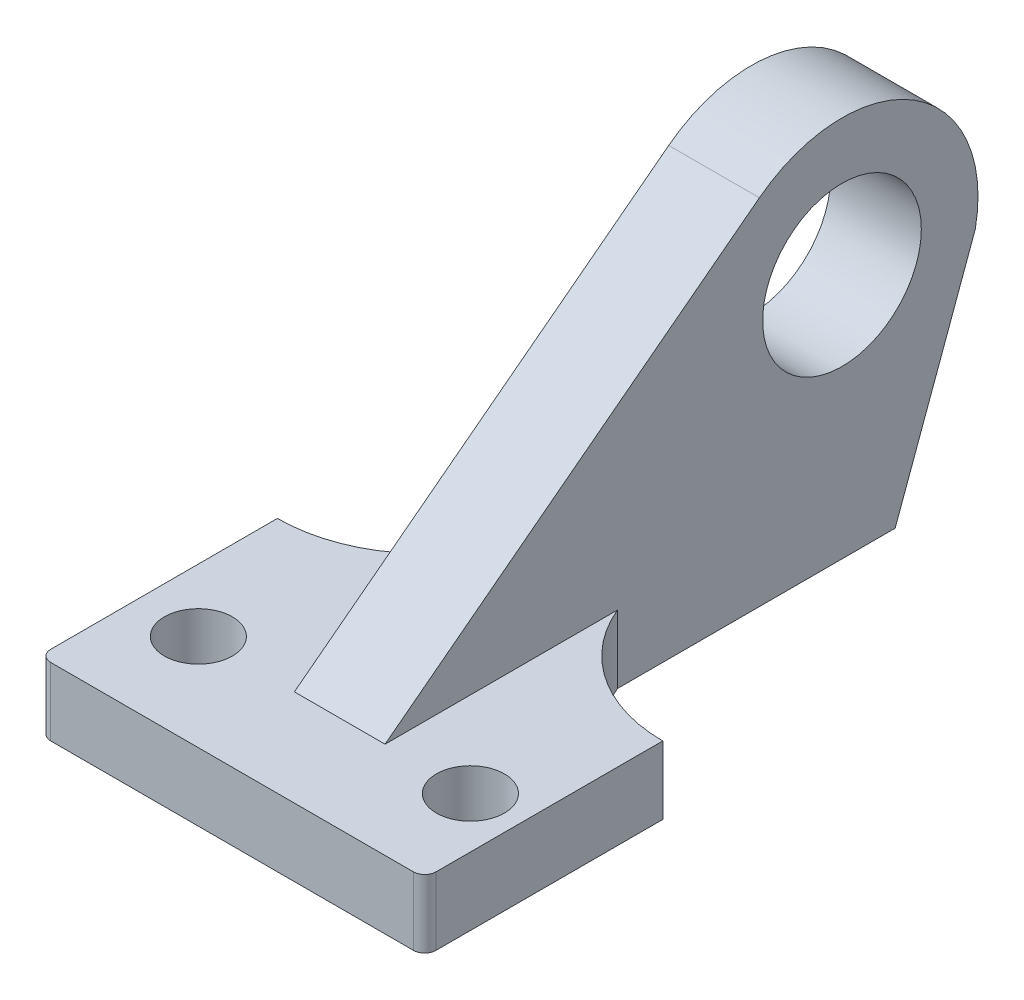
ISO-10303-21;
HEADER;
FILE_DESCRIPTION(('STEP AP214'),'2;1');
FILE_NAME('part.step','',(''),(''),'','','');
FILE_SCHEMA(('AUTOMOTIVE_DESIGN { 1 0 10303 214 1 1 1 1 }'));
ENDSEC;
DATA;
#1=APPLICATION_CONTEXT('core data for automotive mechanical design processes');
#2=APPLICATION_PROTOCOL_DEFINITION('international standard','automotive_design',2000,#1);
#3=PRODUCT_CONTEXT('',#1,'mechanical');
#4=PRODUCT('Part','Part','',(#3));
#5=PRODUCT_RELATED_PRODUCT_CATEGORY('part','',(#4));
#6=PRODUCT_DEFINITION_FORMATION('','',#4);
#7=PRODUCT_DEFINITION_CONTEXT('part definition',#1,'design');
#8=PRODUCT_DEFINITION('design','',#6,#7);
#9=PRODUCT_DEFINITION_SHAPE('','',#8);
#10=(LENGTH_UNIT() NAMED_UNIT(*) SI_UNIT(.MILLI.,.METRE.));
#11=(NAMED_UNIT(*) PLANE_ANGLE_UNIT() SI_UNIT($,.RADIAN.));
#12=(NAMED_UNIT(*) SI_UNIT($,.STERADIAN.) SOLID_ANGLE_UNIT());
#13=UNCERTAINTY_MEASURE_WITH_UNIT(LENGTH_MEASURE(1.E-05),#10,'distance_accuracy_value','');
#14=(GEOMETRIC_REPRESENTATION_CONTEXT(3) GLOBAL_UNCERTAINTY_ASSIGNED_CONTEXT((#13)) GLOBAL_UNIT_ASSIGNED_CONTEXT((#10,
#11,#12)) REPRESENTATION_CONTEXT('',''));
#15=CARTESIAN_POINT('',(0.,0.,0.));
#16=DIRECTION('',(0.,0.,1.));
#17=DIRECTION('',(1.,0.,0.));
#18=AXIS2_PLACEMENT_3D('',#15,#16,#17);
#19=CARTESIAN_POINT('',(38.4671532846715,-12.,-68.));
#20=DIRECTION('',(0.,1.,0.));
#21=DIRECTION('',(0.,0.,1.));
#22=AXIS2_PLACEMENT_3D('',#19,#20,#21);
#23=CYLINDRICAL_SURFACE('',#22,26.);
#24=CARTESIAN_POINT('',(38.4671532846715,-12.,-68.));
#25=DIRECTION('',(0.,1.,0.));
#26=DIRECTION('',(0.,0.,1.));
#27=AXIS2_PLACEMENT_3D('',#24,#25,#26);
#28=CIRCLE('',#27,26.);
#29=CARTESIAN_POINT('',(38.4671532846715,-12.,-42.));
#30=VERTEX_POINT('',#29);
#31=CARTESIAN_POINT('',(14.4671532846715,-12.,-58.));
#32=VERTEX_POINT('',#31);
#33=EDGE_CURVE('E228',#30,#32,#28,.F.);
#34=ORIENTED_EDGE('',*,*,#33,.T.);
#35=DIRECTION('',(0.,1.,0.));
#36=VECTOR('',#35,1.);
#37=CARTESIAN_POINT('',(14.4671532846715,-12.,-58.));
#38=LINE('',#37,#36);
#39=CARTESIAN_POINT('',(14.4671532846715,0.,-58.));
#40=VERTEX_POINT('',#39);
#41=EDGE_CURVE('E156',#32,#40,#38,.T.);
#42=ORIENTED_EDGE('',*,*,#41,.T.);
#43=CARTESIAN_POINT('',(38.4671532846715,0.,-68.));
#44=DIRECTION('',(0.,1.,0.));
#45=DIRECTION('',(0.,0.,1.));
#46=AXIS2_PLACEMENT_3D('',#43,#44,#45);
#47=CIRCLE('',#46,26.);
#48=CARTESIAN_POINT('',(38.4671532846715,0.,-42.));
#49=VERTEX_POINT('',#48);
#50=EDGE_CURVE('E159',#49,#40,#47,.F.);
#51=ORIENTED_EDGE('',*,*,#50,.F.);
#52=DIRECTION('',(0.,1.,0.));
#53=VECTOR('',#52,1.);
#54=CARTESIAN_POINT('',(38.4671532846715,-12.,-42.));
#55=LINE('',#54,#53);
#56=EDGE_CURVE('E185',#30,#49,#55,.T.);
#57=ORIENTED_EDGE('',*,*,#56,.F.);
#58=EDGE_LOOP('',(#34,#42,#51,#57));
#59=FACE_BOUND('',#58,.T.);
#60=ADVANCED_FACE('F39',(#59),#23,.F.);
#61=CARTESIAN_POINT('',(0.,0.,0.));
#62=DIRECTION('',(0.,1.,0.));
#63=DIRECTION('',(0.,0.,1.));
#64=AXIS2_PLACEMENT_3D('',#61,#62,#63);
#65=PLANE('',#64);
#66=CARTESIAN_POINT('',(-18.4742702859235,0.,-17.));
#67=DIRECTION('',(0.,1.,0.));
#68=DIRECTION('',(0.,0.,1.));
#69=AXIS2_PLACEMENT_3D('',#66,#67,#68);
#70=CIRCLE('',#69,6.);
#71=CARTESIAN_POINT('',(-18.4742702859235,0.,-11.));
#72=VERTEX_POINT('',#71);
#73=EDGE_CURVE('E173',#72,#72,#70,.T.);
#74=ORIENTED_EDGE('',*,*,#73,.F.);
#75=EDGE_LOOP('',(#74));
#76=FACE_BOUND('',#75,.T.);
#77=CARTESIAN_POINT('',(29.5257297140765,0.,-17.));
#78=DIRECTION('',(0.,1.,0.));
#79=DIRECTION('',(0.,0.,1.));
#80=AXIS2_PLACEMENT_3D('',#77,#78,#79);
#81=CIRCLE('',#80,6.);
#82=CARTESIAN_POINT('',(29.5257297140765,0.,-11.));
#83=VERTEX_POINT('',#82);
#84=EDGE_CURVE('E176',#83,#83,#81,.T.);
#85=ORIENTED_EDGE('',*,*,#84,.F.);
#86=EDGE_LOOP('',(#85));
#87=FACE_BOUND('',#86,.T.);
#88=ORIENTED_EDGE('',*,*,#50,.T.);
#89=DIRECTION('',(0.,0.,1.));
#90=VECTOR('',#89,1.);
#91=CARTESIAN_POINT('',(14.4671532846715,0.,0.));
#92=LINE('',#91,#90);
#93=CARTESIAN_POINT('',(14.4671532846715,0.,-17.));
#94=VERTEX_POINT('',#93);
#95=EDGE_CURVE('E11',#40,#94,#92,.T.);
#96=ORIENTED_EDGE('',*,*,#95,.T.);
#97=DIRECTION('',(-1.,0.,0.));
#98=VECTOR('',#97,1.);
#99=CARTESIAN_POINT('',(14.4671532846715,0.,-17.));
#100=LINE('',#99,#98);
#101=CARTESIAN_POINT('',(-1.53284671532846,0.,-17.));
#102=VERTEX_POINT('',#101);
#103=EDGE_CURVE('E201',#94,#102,#100,.T.);
#104=ORIENTED_EDGE('',*,*,#103,.T.);
#105=DIRECTION('',(0.,0.,1.));
#106=VECTOR('',#105,1.);
#107=CARTESIAN_POINT('',(-1.53284671532846,0.,0.));
#108=LINE('',#107,#106);
#109=CARTESIAN_POINT('',(-1.53284671532846,0.,-68.));
#110=VERTEX_POINT('',#109);
#111=EDGE_CURVE('E47',#110,#102,#108,.T.);
#112=ORIENTED_EDGE('',*,*,#111,.F.);
#113=DIRECTION('',(-1.,0.,0.));
#114=VECTOR('',#113,1.);
#115=CARTESIAN_POINT('',(0.,0.,-68.));
#116=LINE('',#115,#114);
#117=CARTESIAN_POINT('',(-3.53284671532847,0.,-68.));
#118=VERTEX_POINT('',#117);
#119=EDGE_CURVE('E162',#110,#118,#116,.T.);
#120=ORIENTED_EDGE('',*,*,#119,.T.);
#121=CARTESIAN_POINT('',(-29.5328467153285,0.,-68.));
#122=DIRECTION('',(0.,1.,0.));
#123=DIRECTION('',(0.,0.,1.));
#124=AXIS2_PLACEMENT_3D('',#121,#122,#123);
#125=CIRCLE('',#124,26.);
#126=CARTESIAN_POINT('',(-29.5328467153285,0.,-42.));
#127=VERTEX_POINT('',#126);
#128=EDGE_CURVE('E164',#118,#127,#125,.F.);
#129=ORIENTED_EDGE('',*,*,#128,.T.);
#130=DIRECTION('',(0.,0.,1.));
#131=VECTOR('',#130,1.);
#132=CARTESIAN_POINT('',(-29.5328467153285,0.,0.));
#133=LINE('',#132,#131);
#134=CARTESIAN_POINT('',(-29.5328467153285,0.,-2.00000000000001));
#135=VERTEX_POINT('',#134);
#136=EDGE_CURVE('E167',#127,#135,#133,.T.);
#137=ORIENTED_EDGE('',*,*,#136,.T.);
#138=CARTESIAN_POINT('',(-27.5328467153285,0.,-2.));
#139=DIRECTION('',(0.,1.,0.));
#140=DIRECTION('',(0.,0.,1.));
#141=AXIS2_PLACEMENT_3D('',#138,#139,#140);
#142=CIRCLE('',#141,2.);
#143=CARTESIAN_POINT('',(-27.5328467153284,0.,0.));
#144=VERTEX_POINT('',#143);
#145=EDGE_CURVE('E122',#135,#144,#142,.T.);
#146=ORIENTED_EDGE('',*,*,#145,.T.);
#147=DIRECTION('',(1.,0.,0.));
#148=VECTOR('',#147,1.);
#149=CARTESIAN_POINT('',(0.,0.,0.));
#150=LINE('',#149,#148);
#151=CARTESIAN_POINT('',(36.4671532846715,0.,0.));
#152=VERTEX_POINT('',#151);
#153=EDGE_CURVE('E170',#144,#152,#150,.T.);
#154=ORIENTED_EDGE('',*,*,#153,.T.);
#155=CARTESIAN_POINT('',(36.4671532846715,0.,-2.));
#156=DIRECTION('',(0.,1.,0.));
#157=DIRECTION('',(0.,0.,1.));
#158=AXIS2_PLACEMENT_3D('',#155,#156,#157);
#159=CIRCLE('',#158,2.);
#160=CARTESIAN_POINT('',(38.4671532846715,0.,-2.00000000000001));
#161=VERTEX_POINT('',#160);
#162=EDGE_CURVE('E153',#161,#152,#159,.F.);
#163=ORIENTED_EDGE('',*,*,#162,.F.);
#164=DIRECTION('',(0.,0.,-1.));
#165=VECTOR('',#164,1.);
#166=CARTESIAN_POINT('',(38.4671532846715,0.,0.));
#167=LINE('',#166,#165);
#168=EDGE_CURVE('E155',#161,#49,#167,.T.);
#169=ORIENTED_EDGE('',*,*,#168,.T.);
#170=EDGE_LOOP('',(#88,#96,#104,#112,#120,#129,#137,#146,#154,#163,#169));
#171=FACE_BOUND('',#170,.T.);
#172=ADVANCED_FACE('F202',(#76,#87,#171),#65,.T.);
#173=CARTESIAN_POINT('',(36.4671532846715,-12.,-2.));
#174=DIRECTION('',(0.,1.,0.));
#175=DIRECTION('',(0.,0.,1.));
#176=AXIS2_PLACEMENT_3D('',#173,#174,#175);
#177=CYLINDRICAL_SURFACE('',#176,2.);
#178=ORIENTED_EDGE('',*,*,#162,.T.);
#179=DIRECTION('',(0.,1.,0.));
#180=VECTOR('',#179,1.);
#181=CARTESIAN_POINT('',(36.4671532846715,-12.,0.));
#182=LINE('',#181,#180);
#183=CARTESIAN_POINT('',(36.4671532846715,-12.,0.));
#184=VERTEX_POINT('',#183);
#185=EDGE_CURVE('E94',#184,#152,#182,.T.);
#186=ORIENTED_EDGE('',*,*,#185,.F.);
#187=CARTESIAN_POINT('',(36.4671532846715,-12.,-2.));
#188=DIRECTION('',(0.,1.,0.));
#189=DIRECTION('',(0.,0.,1.));
#190=AXIS2_PLACEMENT_3D('',#187,#188,#189);
#191=CIRCLE('',#190,2.);
#192=CARTESIAN_POINT('',(38.4671532846715,-12.,-2.00000000000001));
#193=VERTEX_POINT('',#192);
#194=EDGE_CURVE('E63',#193,#184,#191,.F.);
#195=ORIENTED_EDGE('',*,*,#194,.F.);
#196=DIRECTION('',(0.,1.,0.));
#197=VECTOR('',#196,1.);
#198=CARTESIAN_POINT('',(38.4671532846715,-12.,-2.00000000000001));
#199=LINE('',#198,#197);
#200=EDGE_CURVE('E102',#193,#161,#199,.T.);
#201=ORIENTED_EDGE('',*,*,#200,.T.);
#202=EDGE_LOOP('',(#178,#186,#195,#201));
#203=FACE_BOUND('',#202,.T.);
#204=ADVANCED_FACE('F41',(#203),#177,.T.);
#205=CARTESIAN_POINT('',(0.,-12.,0.));
#206=DIRECTION('',(0.,0.,1.));
#207=DIRECTION('',(1.,0.,0.));
#208=AXIS2_PLACEMENT_3D('',#205,#206,#207);
#209=PLANE('',#208);
#210=ORIENTED_EDGE('',*,*,#153,.F.);
#211=DIRECTION('',(0.,1.,0.));
#212=VECTOR('',#211,1.);
#213=CARTESIAN_POINT('',(-27.5328467153284,-12.,0.));
#214=LINE('',#213,#212);
#215=CARTESIAN_POINT('',(-27.5328467153284,-12.,0.));
#216=VERTEX_POINT('',#215);
#217=EDGE_CURVE('E127',#216,#144,#214,.T.);
#218=ORIENTED_EDGE('',*,*,#217,.F.);
#219=DIRECTION('',(1.,0.,0.));
#220=VECTOR('',#219,1.);
#221=CARTESIAN_POINT('',(0.,-12.,0.));
#222=LINE('',#221,#220);
#223=EDGE_CURVE('E137',#216,#184,#222,.T.);
#224=ORIENTED_EDGE('',*,*,#223,.T.);
#225=ORIENTED_EDGE('',*,*,#185,.T.);
#226=EDGE_LOOP('',(#210,#218,#224,#225));
#227=FACE_BOUND('',#226,.T.);
#228=ADVANCED_FACE('F318',(#227),#209,.T.);
#229=CARTESIAN_POINT('',(-27.5328467153285,-12.,-2.));
#230=DIRECTION('',(0.,1.,0.));
#231=DIRECTION('',(0.,0.,1.));
#232=AXIS2_PLACEMENT_3D('',#229,#230,#231);
#233=CYLINDRICAL_SURFACE('',#232,2.);
#234=ORIENTED_EDGE('',*,*,#145,.F.);
#235=DIRECTION('',(0.,1.,0.));
#236=VECTOR('',#235,1.);
#237=CARTESIAN_POINT('',(-29.5328467153285,-12.,-2.00000000000001));
#238=LINE('',#237,#236);
#239=CARTESIAN_POINT('',(-29.5328467153285,-12.,-2.00000000000001));
#240=VERTEX_POINT('',#239);
#241=EDGE_CURVE('E117',#240,#135,#238,.T.);
#242=ORIENTED_EDGE('',*,*,#241,.F.);
#243=CARTESIAN_POINT('',(-27.5328467153285,-12.,-2.));
#244=DIRECTION('',(0.,1.,0.));
#245=DIRECTION('',(0.,0.,1.));
#246=AXIS2_PLACEMENT_3D('',#243,#244,#245);
#247=CIRCLE('',#246,2.);
#248=EDGE_CURVE('E120',#240,#216,#247,.T.);
#249=ORIENTED_EDGE('',*,*,#248,.T.);
#250=ORIENTED_EDGE('',*,*,#217,.T.);
#251=EDGE_LOOP('',(#234,#242,#249,#250));
#252=FACE_BOUND('',#251,.T.);
#253=ADVANCED_FACE('F119',(#252),#233,.T.);
#254=CARTESIAN_POINT('',(-29.5328467153285,-12.,0.));
#255=DIRECTION('',(-1.,0.,0.));
#256=DIRECTION('',(0.,0.,1.));
#257=AXIS2_PLACEMENT_3D('',#254,#255,#256);
#258=PLANE('',#257);
#259=ORIENTED_EDGE('',*,*,#136,.F.);
#260=DIRECTION('',(0.,1.,0.));
#261=VECTOR('',#260,1.);
#262=CARTESIAN_POINT('',(-29.5328467153285,-12.,-42.));
#263=LINE('',#262,#261);
#264=CARTESIAN_POINT('',(-29.5328467153285,-12.,-42.));
#265=VERTEX_POINT('',#264);
#266=EDGE_CURVE('E128',#265,#127,#263,.T.);
#267=ORIENTED_EDGE('',*,*,#266,.F.);
#268=DIRECTION('',(0.,0.,1.));
#269=VECTOR('',#268,1.);
#270=CARTESIAN_POINT('',(-29.5328467153285,-12.,0.));
#271=LINE('',#270,#269);
#272=EDGE_CURVE('E135',#265,#240,#271,.T.);
#273=ORIENTED_EDGE('',*,*,#272,.T.);
#274=ORIENTED_EDGE('',*,*,#241,.T.);
#275=EDGE_LOOP('',(#259,#267,#273,#274));
#276=FACE_BOUND('',#275,.T.);
#277=ADVANCED_FACE('F139',(#276),#258,.T.);
#278=CARTESIAN_POINT('',(-29.5328467153285,-12.,-68.));
#279=DIRECTION('',(0.,1.,0.));
#280=DIRECTION('',(0.,0.,1.));
#281=AXIS2_PLACEMENT_3D('',#278,#279,#280);
#282=CYLINDRICAL_SURFACE('',#281,26.);
#283=ORIENTED_EDGE('',*,*,#128,.F.);
#284=DIRECTION('',(0.,1.,0.));
#285=VECTOR('',#284,1.);
#286=CARTESIAN_POINT('',(-3.53284671532847,-12.,-68.));
#287=LINE('',#286,#285);
#288=CARTESIAN_POINT('',(-3.53284671532847,-12.,-68.));
#289=VERTEX_POINT('',#288);
#290=EDGE_CURVE('E182',#289,#118,#287,.T.);
#291=ORIENTED_EDGE('',*,*,#290,.F.);
#292=CARTESIAN_POINT('',(-29.5328467153285,-12.,-68.));
#293=DIRECTION('',(0.,1.,0.));
#294=DIRECTION('',(0.,0.,1.));
#295=AXIS2_PLACEMENT_3D('',#292,#293,#294);
#296=CIRCLE('',#295,26.);
#297=EDGE_CURVE('E140',#289,#265,#296,.F.);
#298=ORIENTED_EDGE('',*,*,#297,.T.);
#299=ORIENTED_EDGE('',*,*,#266,.T.);
#300=EDGE_LOOP('',(#283,#291,#298,#299));
#301=FACE_BOUND('',#300,.T.);
#302=ADVANCED_FACE('F237',(#301),#282,.F.);
#303=CARTESIAN_POINT('',(0.,-12.,-68.));
#304=DIRECTION('',(0.,0.,-1.));
#305=DIRECTION('',(-1.,0.,0.));
#306=AXIS2_PLACEMENT_3D('',#303,#304,#305);
#307=PLANE('',#306);
#308=DIRECTION('',(0.,1.,0.));
#309=VECTOR('',#308,1.);
#310=CARTESIAN_POINT('',(-1.53284671532846,-12.,-68.));
#311=LINE('',#310,#309);
#312=CARTESIAN_POINT('',(-1.53284671532846,-12.,-68.));
#313=VERTEX_POINT('',#312);
#314=EDGE_CURVE('E198',#313,#110,#311,.T.);
#315=ORIENTED_EDGE('',*,*,#314,.F.);
#316=DIRECTION('',(-1.,0.,0.));
#317=VECTOR('',#316,1.);
#318=CARTESIAN_POINT('',(0.,-12.,-68.));
#319=LINE('',#318,#317);
#320=EDGE_CURVE('E142',#313,#289,#319,.T.);
#321=ORIENTED_EDGE('',*,*,#320,.T.);
#322=ORIENTED_EDGE('',*,*,#290,.T.);
#323=ORIENTED_EDGE('',*,*,#119,.F.);
#324=EDGE_LOOP('',(#315,#321,#322,#323));
#325=FACE_BOUND('',#324,.T.);
#326=ADVANCED_FACE('F232',(#325),#307,.T.);
#327=CARTESIAN_POINT('',(-18.4742702859235,-12.,-17.));
#328=DIRECTION('',(0.,1.,0.));
#329=DIRECTION('',(0.,0.,1.));
#330=AXIS2_PLACEMENT_3D('',#327,#328,#329);
#331=CYLINDRICAL_SURFACE('',#330,6.);
#332=CARTESIAN_POINT('',(-18.4742702859235,-12.,-17.));
#333=DIRECTION('',(0.,1.,0.));
#334=DIRECTION('',(0.,0.,1.));
#335=AXIS2_PLACEMENT_3D('',#332,#333,#334);
#336=CIRCLE('',#335,6.);
#337=CARTESIAN_POINT('',(-18.4742702859235,-12.,-11.));
#338=VERTEX_POINT('',#337);
#339=EDGE_CURVE('E147',#338,#338,#336,.T.);
#340=ORIENTED_EDGE('',*,*,#339,.F.);
#341=EDGE_LOOP('',(#340));
#342=FACE_BOUND('',#341,.T.);
#343=ORIENTED_EDGE('',*,*,#73,.T.);
#344=EDGE_LOOP('',(#343));
#345=FACE_BOUND('',#344,.T.);
#346=ADVANCED_FACE('F293',(#342,#345),#331,.F.);
#347=CARTESIAN_POINT('',(38.4671532846715,-12.,0.));
#348=DIRECTION('',(1.,0.,0.));
#349=DIRECTION('',(0.,0.,-1.));
#350=AXIS2_PLACEMENT_3D('',#347,#348,#349);
#351=PLANE('',#350);
#352=ORIENTED_EDGE('',*,*,#168,.F.);
#353=ORIENTED_EDGE('',*,*,#200,.F.);
#354=DIRECTION('',(0.,0.,-1.));
#355=VECTOR('',#354,1.);
#356=CARTESIAN_POINT('',(38.4671532846715,-12.,0.));
#357=LINE('',#356,#355);
#358=EDGE_CURVE('E226',#193,#30,#357,.T.);
#359=ORIENTED_EDGE('',*,*,#358,.T.);
#360=ORIENTED_EDGE('',*,*,#56,.T.);
#361=EDGE_LOOP('',(#352,#353,#359,#360));
#362=FACE_BOUND('',#361,.T.);
#363=ADVANCED_FACE('F290',(#362),#351,.T.);
#364=CARTESIAN_POINT('',(29.5257297140765,-12.,-17.));
#365=DIRECTION('',(0.,1.,0.));
#366=DIRECTION('',(0.,0.,1.));
#367=AXIS2_PLACEMENT_3D('',#364,#365,#366);
#368=CYLINDRICAL_SURFACE('',#367,6.);
#369=CARTESIAN_POINT('',(29.5257297140765,-12.,-17.));
#370=DIRECTION('',(0.,1.,0.));
#371=DIRECTION('',(0.,0.,1.));
#372=AXIS2_PLACEMENT_3D('',#369,#370,#371);
#373=CIRCLE('',#372,6.);
#374=CARTESIAN_POINT('',(29.5257297140765,-12.,-11.));
#375=VERTEX_POINT('',#374);
#376=EDGE_CURVE('E150',#375,#375,#373,.T.);
#377=ORIENTED_EDGE('',*,*,#376,.F.);
#378=EDGE_LOOP('',(#377));
#379=FACE_BOUND('',#378,.T.);
#380=ORIENTED_EDGE('',*,*,#84,.T.);
#381=EDGE_LOOP('',(#380));
#382=FACE_BOUND('',#381,.T.);
#383=ADVANCED_FACE('F292',(#379,#382),#368,.F.);
#384=CARTESIAN_POINT('',(0.,-12.,0.));
#385=DIRECTION('',(0.,1.,0.));
#386=DIRECTION('',(0.,0.,1.));
#387=AXIS2_PLACEMENT_3D('',#384,#385,#386);
#388=PLANE('',#387);
#389=ORIENTED_EDGE('',*,*,#320,.F.);
#390=DIRECTION('',(0.,0.,-1.));
#391=VECTOR('',#390,1.);
#392=CARTESIAN_POINT('',(-1.53284671532846,-12.,-17.));
#393=LINE('',#392,#391);
#394=CARTESIAN_POINT('',(-1.53284671532846,-12.,-107.));
#395=VERTEX_POINT('',#394);
#396=EDGE_CURVE('E270',#313,#395,#393,.T.);
#397=ORIENTED_EDGE('',*,*,#396,.T.);
#398=DIRECTION('',(-1.,0.,0.));
#399=VECTOR('',#398,1.);
#400=CARTESIAN_POINT('',(14.4671532846715,-12.,-107.));
#401=LINE('',#400,#399);
#402=CARTESIAN_POINT('',(14.4671532846715,-12.,-107.));
#403=VERTEX_POINT('',#402);
#404=EDGE_CURVE('E219',#403,#395,#401,.T.);
#405=ORIENTED_EDGE('',*,*,#404,.F.);
#406=DIRECTION('',(0.,0.,-1.));
#407=VECTOR('',#406,1.);
#408=CARTESIAN_POINT('',(14.4671532846715,-12.,-17.));
#409=LINE('',#408,#407);
#410=EDGE_CURVE('E261',#32,#403,#409,.T.);
#411=ORIENTED_EDGE('',*,*,#410,.F.);
#412=ORIENTED_EDGE('',*,*,#33,.F.);
#413=ORIENTED_EDGE('',*,*,#358,.F.);
#414=ORIENTED_EDGE('',*,*,#194,.T.);
#415=ORIENTED_EDGE('',*,*,#223,.F.);
#416=ORIENTED_EDGE('',*,*,#248,.F.);
#417=ORIENTED_EDGE('',*,*,#272,.F.);
#418=ORIENTED_EDGE('',*,*,#297,.F.);
#419=EDGE_LOOP('',(#389,#397,#405,#411,#412,#413,#414,#415,#416,#417,#418));
#420=FACE_BOUND('',#419,.T.);
#421=ORIENTED_EDGE('',*,*,#376,.T.);
#422=EDGE_LOOP('',(#421));
#423=FACE_BOUND('',#422,.T.);
#424=ORIENTED_EDGE('',*,*,#339,.T.);
#425=EDGE_LOOP('',(#424));
#426=FACE_BOUND('',#425,.T.);
#427=ADVANCED_FACE('F132',(#420,#423,#426),#388,.F.);
#428=CARTESIAN_POINT('',(14.4671532846715,31.3997189533628,-97.6196412008467));
#429=DIRECTION('',(-1.,0.,0.));
#430=DIRECTION('',(0.,0.,1.));
#431=AXIS2_PLACEMENT_3D('',#428,#429,#430);
#432=PLANE('',#431);
#433=ORIENTED_EDGE('',*,*,#41,.F.);
#434=ORIENTED_EDGE('',*,*,#410,.T.);
#435=DIRECTION('',(0.,0.939074933107021,-0.343712481603512));
#436=VECTOR('',#435,1.);
#437=CARTESIAN_POINT('',(14.4671532846715,-12.,-107.));
#438=LINE('',#437,#436);
#439=CARTESIAN_POINT('',(14.4671532846715,26.6414307456228,-121.143218593158));
#440=VERTEX_POINT('',#439);
#441=EDGE_CURVE('E266',#403,#440,#438,.T.);
#442=ORIENTED_EDGE('',*,*,#441,.T.);
#443=CARTESIAN_POINT('',(14.4671532846715,31.3997189533628,-97.6196412008467));
#444=DIRECTION('',(1.,0.,0.));
#445=DIRECTION('',(0.,0.,1.));
#446=AXIS2_PLACEMENT_3D('',#443,#444,#445);
#447=CIRCLE('',#446,24.);
#448=CARTESIAN_POINT('',(14.4671532846715,50.4695320250345,-83.0476739550868));
#449=VERTEX_POINT('',#448);
#450=EDGE_CURVE('E212',#440,#449,#447,.T.);
#451=ORIENTED_EDGE('',*,*,#450,.T.);
#452=DIRECTION('',(0.,-0.607165301906663,0.794575544652987));
#453=VECTOR('',#452,1.);
#454=CARTESIAN_POINT('',(14.4671532846715,0.,-17.));
#455=LINE('',#454,#453);
#456=EDGE_CURVE('E207',#449,#94,#455,.T.);
#457=ORIENTED_EDGE('',*,*,#456,.T.);
#458=ORIENTED_EDGE('',*,*,#95,.F.);
#459=EDGE_LOOP('',(#433,#434,#442,#451,#457,#458));
#460=FACE_BOUND('',#459,.T.);
#461=CARTESIAN_POINT('',(14.4671532846715,31.3997189533628,-97.6196412008467));
#462=DIRECTION('',(1.,0.,0.));
#463=DIRECTION('',(0.,0.,-1.));
#464=AXIS2_PLACEMENT_3D('',#461,#462,#463);
#465=CIRCLE('',#464,14.);
#466=CARTESIAN_POINT('',(14.4671532846715,31.3997189533628,-111.619641200847));
#467=VERTEX_POINT('',#466);
#468=EDGE_CURVE('E281',#467,#467,#465,.T.);
#469=ORIENTED_EDGE('',*,*,#468,.F.);
#470=EDGE_LOOP('',(#469));
#471=FACE_BOUND('',#470,.T.);
#472=ADVANCED_FACE('F263',(#460,#471),#432,.F.);
#473=CARTESIAN_POINT('',(-1.53284671532846,31.3997189533628,-97.6196412008467));
#474=DIRECTION('',(-1.,0.,0.));
#475=DIRECTION('',(0.,0.,1.));
#476=AXIS2_PLACEMENT_3D('',#473,#474,#475);
#477=PLANE('',#476);
#478=ORIENTED_EDGE('',*,*,#396,.F.);
#479=ORIENTED_EDGE('',*,*,#314,.T.);
#480=ORIENTED_EDGE('',*,*,#111,.T.);
#481=DIRECTION('',(0.,-0.607165301906663,0.794575544652987));
#482=VECTOR('',#481,1.);
#483=CARTESIAN_POINT('',(-1.53284671532846,0.,-17.));
#484=LINE('',#483,#482);
#485=CARTESIAN_POINT('',(-1.53284671532846,50.4695320250345,-83.0476739550868));
#486=VERTEX_POINT('',#485);
#487=EDGE_CURVE('E54',#486,#102,#484,.T.);
#488=ORIENTED_EDGE('',*,*,#487,.F.);
#489=CARTESIAN_POINT('',(-1.53284671532846,31.3997189533628,-97.6196412008467));
#490=DIRECTION('',(1.,0.,0.));
#491=DIRECTION('',(0.,0.,1.));
#492=AXIS2_PLACEMENT_3D('',#489,#490,#491);
#493=CIRCLE('',#492,24.);
#494=CARTESIAN_POINT('',(-1.53284671532846,26.6414307456228,-121.143218593158));
#495=VERTEX_POINT('',#494);
#496=EDGE_CURVE('E282',#495,#486,#493,.T.);
#497=ORIENTED_EDGE('',*,*,#496,.F.);
#498=DIRECTION('',(0.,0.939074933107021,-0.343712481603512));
#499=VECTOR('',#498,1.);
#500=CARTESIAN_POINT('',(-1.53284671532846,-12.,-107.));
#501=LINE('',#500,#499);
#502=EDGE_CURVE('E280',#395,#495,#501,.T.);
#503=ORIENTED_EDGE('',*,*,#502,.F.);
#504=EDGE_LOOP('',(#478,#479,#480,#488,#497,#503));
#505=FACE_BOUND('',#504,.T.);
#506=CARTESIAN_POINT('',(-1.53284671532846,31.3997189533628,-97.6196412008467));
#507=DIRECTION('',(1.,0.,0.));
#508=DIRECTION('',(0.,0.,-1.));
#509=AXIS2_PLACEMENT_3D('',#506,#507,#508);
#510=CIRCLE('',#509,14.);
#511=CARTESIAN_POINT('',(-1.53284671532846,31.3997189533628,-111.619641200847));
#512=VERTEX_POINT('',#511);
#513=EDGE_CURVE('E343',#512,#512,#510,.T.);
#514=ORIENTED_EDGE('',*,*,#513,.T.);
#515=EDGE_LOOP('',(#514));
#516=FACE_BOUND('',#515,.T.);
#517=ADVANCED_FACE('F192',(#505,#516),#477,.T.);
#518=CARTESIAN_POINT('',(14.4671532846715,-12.,-107.));
#519=DIRECTION('',(0.,0.343712481603512,0.939074933107021));
#520=DIRECTION('',(0.,-0.939074933107021,0.343712481603512));
#521=AXIS2_PLACEMENT_3D('',#518,#519,#520);
#522=PLANE('',#521);
#523=ORIENTED_EDGE('',*,*,#502,.T.);
#524=DIRECTION('',(-1.,0.,0.));
#525=VECTOR('',#524,1.);
#526=CARTESIAN_POINT('',(14.4671532846715,26.6414307456228,-121.143218593158));
#527=LINE('',#526,#525);
#528=EDGE_CURVE('E209',#440,#495,#527,.T.);
#529=ORIENTED_EDGE('',*,*,#528,.F.);
#530=ORIENTED_EDGE('',*,*,#441,.F.);
#531=ORIENTED_EDGE('',*,*,#404,.T.);
#532=EDGE_LOOP('',(#523,#529,#530,#531));
#533=FACE_BOUND('',#532,.T.);
#534=ADVANCED_FACE('F273',(#533),#522,.F.);
#535=CARTESIAN_POINT('',(14.4671532846715,31.3997189533628,-97.6196412008467));
#536=DIRECTION('',(-1.,0.,0.));
#537=DIRECTION('',(0.,0.,1.));
#538=AXIS2_PLACEMENT_3D('',#535,#536,#537);
#539=CYLINDRICAL_SURFACE('',#538,24.);
#540=ORIENTED_EDGE('',*,*,#496,.T.);
#541=DIRECTION('',(-1.,0.,0.));
#542=VECTOR('',#541,1.);
#543=CARTESIAN_POINT('',(14.4671532846715,50.4695320250345,-83.0476739550868));
#544=LINE('',#543,#542);
#545=EDGE_CURVE('E206',#449,#486,#544,.T.);
#546=ORIENTED_EDGE('',*,*,#545,.F.);
#547=ORIENTED_EDGE('',*,*,#450,.F.);
#548=ORIENTED_EDGE('',*,*,#528,.T.);
#549=EDGE_LOOP('',(#540,#546,#547,#548));
#550=FACE_BOUND('',#549,.T.);
#551=ADVANCED_FACE('F285',(#550),#539,.T.);
#552=CARTESIAN_POINT('',(14.4671532846715,0.,-17.));
#553=DIRECTION('',(0.,-0.794575544652987,-0.607165301906663));
#554=DIRECTION('',(0.,0.607165301906663,-0.794575544652987));
#555=AXIS2_PLACEMENT_3D('',#552,#553,#554);
#556=PLANE('',#555);
#557=ORIENTED_EDGE('',*,*,#487,.T.);
#558=ORIENTED_EDGE('',*,*,#103,.F.);
#559=ORIENTED_EDGE('',*,*,#456,.F.);
#560=ORIENTED_EDGE('',*,*,#545,.T.);
#561=EDGE_LOOP('',(#557,#558,#559,#560));
#562=FACE_BOUND('',#561,.T.);
#563=ADVANCED_FACE('F286',(#562),#556,.F.);
#564=CARTESIAN_POINT('',(14.4671532846715,31.3997189533628,-97.6196412008467));
#565=DIRECTION('',(-1.,0.,0.));
#566=DIRECTION('',(0.,0.,1.));
#567=AXIS2_PLACEMENT_3D('',#564,#565,#566);
#568=CYLINDRICAL_SURFACE('',#567,14.);
#569=ORIENTED_EDGE('',*,*,#468,.T.);
#570=EDGE_LOOP('',(#569));
#571=FACE_BOUND('',#570,.T.);
#572=ORIENTED_EDGE('',*,*,#513,.F.);
#573=EDGE_LOOP('',(#572));
#574=FACE_BOUND('',#573,.T.);
#575=ADVANCED_FACE('F329',(#571,#574),#568,.F.);
#576=CLOSED_SHELL('',(#60,#172,#204,#228,#253,#277,#302,#326,#346,#363,#383,#427,#472,#517,#534,
#551,#563,#575));
#577=MANIFOLD_SOLID_BREP('B2',#576);
#578=ADVANCED_BREP_SHAPE_REPRESENTATION('',(#18,#577),#14);
#579=SHAPE_DEFINITION_REPRESENTATION(#9,#578);
ENDSEC;
END-ISO-10303-21;
